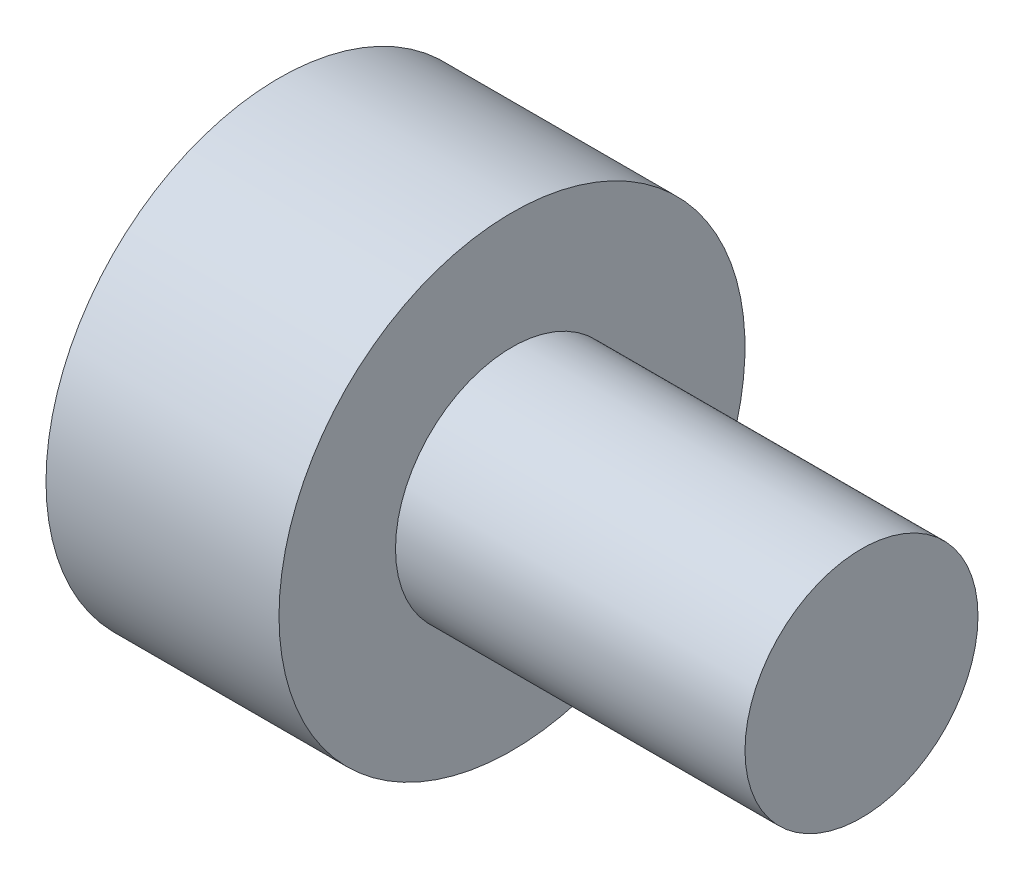
ISO-10303-21;
HEADER;
FILE_DESCRIPTION(('STEP AP214'),'2;1');
FILE_NAME('part.step','',(''),(''),'','','');
FILE_SCHEMA(('AUTOMOTIVE_DESIGN { 1 0 10303 214 1 1 1 1 }'));
ENDSEC;
DATA;
#1=APPLICATION_CONTEXT('core data for automotive mechanical design processes');
#2=APPLICATION_PROTOCOL_DEFINITION('international standard','automotive_design',2000,#1);
#3=PRODUCT_CONTEXT('',#1,'mechanical');
#4=PRODUCT('Part','Part','',(#3));
#5=PRODUCT_RELATED_PRODUCT_CATEGORY('part','',(#4));
#6=PRODUCT_DEFINITION_FORMATION('','',#4);
#7=PRODUCT_DEFINITION_CONTEXT('part definition',#1,'design');
#8=PRODUCT_DEFINITION('design','',#6,#7);
#9=PRODUCT_DEFINITION_SHAPE('','',#8);
#10=(LENGTH_UNIT() NAMED_UNIT(*) SI_UNIT(.MILLI.,.METRE.));
#11=(NAMED_UNIT(*) PLANE_ANGLE_UNIT() SI_UNIT($,.RADIAN.));
#12=(NAMED_UNIT(*) SI_UNIT($,.STERADIAN.) SOLID_ANGLE_UNIT());
#13=UNCERTAINTY_MEASURE_WITH_UNIT(LENGTH_MEASURE(1.E-05),#10,'distance_accuracy_value','');
#14=(GEOMETRIC_REPRESENTATION_CONTEXT(3) GLOBAL_UNCERTAINTY_ASSIGNED_CONTEXT((#13)) GLOBAL_UNIT_ASSIGNED_CONTEXT((#10,
#11,#12)) REPRESENTATION_CONTEXT('',''));
#15=CARTESIAN_POINT('',(0.,0.,0.));
#16=DIRECTION('',(0.,0.,1.));
#17=DIRECTION('',(1.,0.,0.));
#18=AXIS2_PLACEMENT_3D('',#15,#16,#17);
#19=CARTESIAN_POINT('',(0.,20.,0.));
#20=DIRECTION('',(1.,0.,0.));
#21=DIRECTION('',(0.,0.,-1.));
#22=AXIS2_PLACEMENT_3D('',#19,#20,#21);
#23=PLANE('',#22);
#24=CARTESIAN_POINT('',(0.,0.,0.));
#25=DIRECTION('',(-1.,0.,0.));
#26=DIRECTION('',(0.,0.,1.));
#27=AXIS2_PLACEMENT_3D('',#24,#25,#26);
#28=CIRCLE('',#27,20.);
#29=CARTESIAN_POINT('',(0.,0.,20.));
#30=VERTEX_POINT('',#29);
#31=EDGE_CURVE('E10',#30,#30,#28,.T.);
#32=ORIENTED_EDGE('',*,*,#31,.T.);
#33=EDGE_LOOP('',(#32));
#34=FACE_BOUND('',#33,.T.);
#35=ADVANCED_FACE('F33',(#34),#23,.F.);
#36=CARTESIAN_POINT('',(0.,0.,0.));
#37=DIRECTION('',(-1.,0.,0.));
#38=DIRECTION('',(0.,0.,1.));
#39=AXIS2_PLACEMENT_3D('',#36,#37,#38);
#40=CYLINDRICAL_SURFACE('',#39,20.);
#41=ORIENTED_EDGE('',*,*,#31,.F.);
#42=EDGE_LOOP('',(#41));
#43=FACE_BOUND('',#42,.T.);
#44=CARTESIAN_POINT('',(20.,0.,0.));
#45=DIRECTION('',(-1.,0.,0.));
#46=DIRECTION('',(0.,0.,1.));
#47=AXIS2_PLACEMENT_3D('',#44,#45,#46);
#48=CIRCLE('',#47,20.);
#49=CARTESIAN_POINT('',(20.,0.,20.));
#50=VERTEX_POINT('',#49);
#51=EDGE_CURVE('E39',#50,#50,#48,.T.);
#52=ORIENTED_EDGE('',*,*,#51,.T.);
#53=EDGE_LOOP('',(#52));
#54=FACE_BOUND('',#53,.T.);
#55=ADVANCED_FACE('F65',(#43,#54),#40,.T.);
#56=CARTESIAN_POINT('',(20.,10.,0.));
#57=DIRECTION('',(-1.,0.,0.));
#58=DIRECTION('',(0.,0.,1.));
#59=AXIS2_PLACEMENT_3D('',#56,#57,#58);
#60=PLANE('',#59);
#61=ORIENTED_EDGE('',*,*,#51,.F.);
#62=EDGE_LOOP('',(#61));
#63=FACE_BOUND('',#62,.T.);
#64=CARTESIAN_POINT('',(20.,0.,0.));
#65=DIRECTION('',(-1.,0.,0.));
#66=DIRECTION('',(0.,0.,1.));
#67=AXIS2_PLACEMENT_3D('',#64,#65,#66);
#68=CIRCLE('',#67,10.);
#69=CARTESIAN_POINT('',(20.,0.,10.));
#70=VERTEX_POINT('',#69);
#71=EDGE_CURVE('E43',#70,#70,#68,.T.);
#72=ORIENTED_EDGE('',*,*,#71,.T.);
#73=EDGE_LOOP('',(#72));
#74=FACE_BOUND('',#73,.T.);
#75=ADVANCED_FACE('F61',(#63,#74),#60,.F.);
#76=CARTESIAN_POINT('',(0.,0.,0.));
#77=DIRECTION('',(-1.,0.,0.));
#78=DIRECTION('',(0.,0.,1.));
#79=AXIS2_PLACEMENT_3D('',#76,#77,#78);
#80=CYLINDRICAL_SURFACE('',#79,10.);
#81=ORIENTED_EDGE('',*,*,#71,.F.);
#82=EDGE_LOOP('',(#81));
#83=FACE_BOUND('',#82,.T.);
#84=CARTESIAN_POINT('',(50.,0.,0.));
#85=DIRECTION('',(-1.,0.,0.));
#86=DIRECTION('',(0.,0.,1.));
#87=AXIS2_PLACEMENT_3D('',#84,#85,#86);
#88=CIRCLE('',#87,10.);
#89=CARTESIAN_POINT('',(50.,0.,10.));
#90=VERTEX_POINT('',#89);
#91=EDGE_CURVE('E47',#90,#90,#88,.T.);
#92=ORIENTED_EDGE('',*,*,#91,.T.);
#93=EDGE_LOOP('',(#92));
#94=FACE_BOUND('',#93,.T.);
#95=ADVANCED_FACE('F53',(#83,#94),#80,.T.);
#96=CARTESIAN_POINT('',(50.,10.,0.));
#97=DIRECTION('',(-1.,0.,0.));
#98=DIRECTION('',(0.,0.,1.));
#99=AXIS2_PLACEMENT_3D('',#96,#97,#98);
#100=PLANE('',#99);
#101=ORIENTED_EDGE('',*,*,#91,.F.);
#102=EDGE_LOOP('',(#101));
#103=FACE_BOUND('',#102,.T.);
#104=ADVANCED_FACE('F55',(#103),#100,.F.);
#105=CLOSED_SHELL('',(#35,#55,#75,#95,#104));
#106=MANIFOLD_SOLID_BREP('B2',#105);
#107=ADVANCED_BREP_SHAPE_REPRESENTATION('',(#18,#106),#14);
#108=SHAPE_DEFINITION_REPRESENTATION(#9,#107);
ENDSEC;
END-ISO-10303-21;
